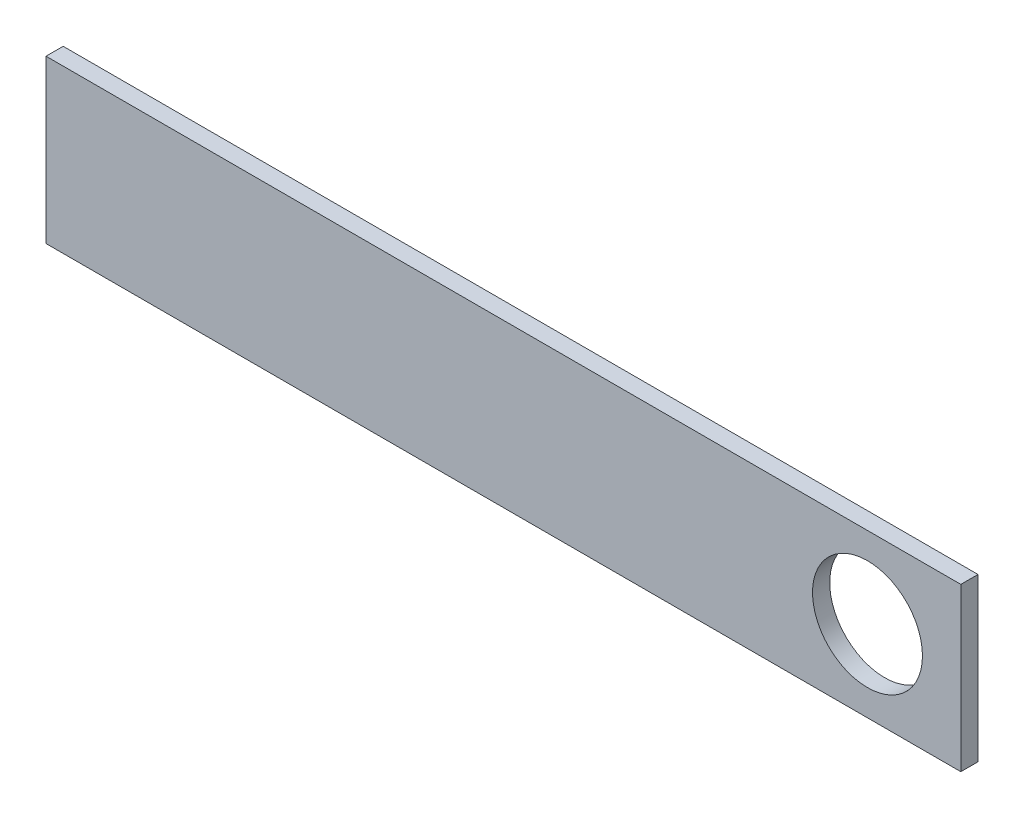
ISO-10303-21;
HEADER;
FILE_DESCRIPTION(('STEP AP214'),'2;1');
FILE_NAME('part.step','',(''),(''),'','','');
FILE_SCHEMA(('AUTOMOTIVE_DESIGN { 1 0 10303 214 1 1 1 1 }'));
ENDSEC;
DATA;
#1=APPLICATION_CONTEXT('core data for automotive mechanical design processes');
#2=APPLICATION_PROTOCOL_DEFINITION('international standard','automotive_design',2000,#1);
#3=PRODUCT_CONTEXT('',#1,'mechanical');
#4=PRODUCT('Part','Part','',(#3));
#5=PRODUCT_RELATED_PRODUCT_CATEGORY('part','',(#4));
#6=PRODUCT_DEFINITION_FORMATION('','',#4);
#7=PRODUCT_DEFINITION_CONTEXT('part definition',#1,'design');
#8=PRODUCT_DEFINITION('design','',#6,#7);
#9=PRODUCT_DEFINITION_SHAPE('','',#8);
#10=(LENGTH_UNIT() NAMED_UNIT(*) SI_UNIT(.MILLI.,.METRE.));
#11=(NAMED_UNIT(*) PLANE_ANGLE_UNIT() SI_UNIT($,.RADIAN.));
#12=(NAMED_UNIT(*) SI_UNIT($,.STERADIAN.) SOLID_ANGLE_UNIT());
#13=UNCERTAINTY_MEASURE_WITH_UNIT(LENGTH_MEASURE(1.E-05),#10,'distance_accuracy_value','');
#14=(GEOMETRIC_REPRESENTATION_CONTEXT(3) GLOBAL_UNCERTAINTY_ASSIGNED_CONTEXT((#13)) GLOBAL_UNIT_ASSIGNED_CONTEXT((#10,
#11,#12)) REPRESENTATION_CONTEXT('',''));
#15=CARTESIAN_POINT('',(0.,0.,0.));
#16=DIRECTION('',(0.,0.,1.));
#17=DIRECTION('',(1.,0.,0.));
#18=AXIS2_PLACEMENT_3D('',#15,#16,#17);
#19=CARTESIAN_POINT('',(-67.8561110498564,-48.7503047618274,-2.54));
#20=DIRECTION('',(-1.,0.,0.));
#21=DIRECTION('',(0.,0.,1.));
#22=AXIS2_PLACEMENT_3D('',#19,#20,#21);
#23=PLANE('',#22);
#24=DIRECTION('',(0.,-1.,0.));
#25=VECTOR('',#24,1.);
#26=CARTESIAN_POINT('',(-67.8561110498564,-48.7503047618274,0.));
#27=LINE('',#26,#25);
#28=CARTESIAN_POINT('',(-67.8561110498564,-48.7503047618274,0.));
#29=VERTEX_POINT('',#28);
#30=CARTESIAN_POINT('',(-67.8561110498564,-72.7506400697544,0.));
#31=VERTEX_POINT('',#30);
#32=EDGE_CURVE('E99',#29,#31,#27,.T.);
#33=ORIENTED_EDGE('',*,*,#32,.F.);
#34=DIRECTION('',(0.,0.,1.));
#35=VECTOR('',#34,1.);
#36=CARTESIAN_POINT('',(-67.8561110498564,-48.7503047618274,-2.54));
#37=LINE('',#36,#35);
#38=CARTESIAN_POINT('',(-67.8561110498564,-48.7503047618274,-2.54));
#39=VERTEX_POINT('',#38);
#40=EDGE_CURVE('E11',#39,#29,#37,.T.);
#41=ORIENTED_EDGE('',*,*,#40,.F.);
#42=DIRECTION('',(0.,-1.,0.));
#43=VECTOR('',#42,1.);
#44=CARTESIAN_POINT('',(-67.8561110498564,-48.7503047618274,-2.54));
#45=LINE('',#44,#43);
#46=CARTESIAN_POINT('',(-67.8561110498564,-72.7506400697544,-2.54));
#47=VERTEX_POINT('',#46);
#48=EDGE_CURVE('E92',#39,#47,#45,.T.);
#49=ORIENTED_EDGE('',*,*,#48,.T.);
#50=DIRECTION('',(0.,0.,1.));
#51=VECTOR('',#50,1.);
#52=CARTESIAN_POINT('',(-67.8561110498564,-72.7506400697544,-2.54));
#53=LINE('',#52,#51);
#54=EDGE_CURVE('E37',#47,#31,#53,.T.);
#55=ORIENTED_EDGE('',*,*,#54,.T.);
#56=EDGE_LOOP('',(#33,#41,#49,#55));
#57=FACE_BOUND('',#56,.T.);
#58=ADVANCED_FACE('F34',(#57),#23,.T.);
#59=CARTESIAN_POINT('',(-67.8561110498564,-48.7503047618274,-2.54));
#60=DIRECTION('',(0.,1.,0.));
#61=DIRECTION('',(0.,0.,1.));
#62=AXIS2_PLACEMENT_3D('',#59,#60,#61);
#63=PLANE('',#62);
#64=DIRECTION('',(-1.,0.,0.));
#65=VECTOR('',#64,1.);
#66=CARTESIAN_POINT('',(-67.8561110498564,-48.7503047618274,0.));
#67=LINE('',#66,#65);
#68=CARTESIAN_POINT('',(67.4652240809156,-48.7503047618274,0.));
#69=VERTEX_POINT('',#68);
#70=EDGE_CURVE('E94',#69,#29,#67,.T.);
#71=ORIENTED_EDGE('',*,*,#70,.F.);
#72=DIRECTION('',(0.,0.,1.));
#73=VECTOR('',#72,1.);
#74=CARTESIAN_POINT('',(67.4652240809156,-48.7503047618274,-2.54));
#75=LINE('',#74,#73);
#76=CARTESIAN_POINT('',(67.4652240809156,-48.7503047618274,-2.54));
#77=VERTEX_POINT('',#76);
#78=EDGE_CURVE('E43',#77,#69,#75,.T.);
#79=ORIENTED_EDGE('',*,*,#78,.F.);
#80=DIRECTION('',(-1.,0.,0.));
#81=VECTOR('',#80,1.);
#82=CARTESIAN_POINT('',(-67.8561110498564,-48.7503047618274,-2.54));
#83=LINE('',#82,#81);
#84=EDGE_CURVE('E89',#77,#39,#83,.T.);
#85=ORIENTED_EDGE('',*,*,#84,.T.);
#86=ORIENTED_EDGE('',*,*,#40,.T.);
#87=EDGE_LOOP('',(#71,#79,#85,#86));
#88=FACE_BOUND('',#87,.T.);
#89=ADVANCED_FACE('F110',(#88),#63,.T.);
#90=CARTESIAN_POINT('',(67.4652240809156,-48.7503047618274,-2.54));
#91=DIRECTION('',(1.,0.,0.));
#92=DIRECTION('',(0.,0.,-1.));
#93=AXIS2_PLACEMENT_3D('',#90,#91,#92);
#94=PLANE('',#93);
#95=DIRECTION('',(0.,1.,0.));
#96=VECTOR('',#95,1.);
#97=CARTESIAN_POINT('',(67.4652240809156,-48.7503047618274,0.));
#98=LINE('',#97,#96);
#99=CARTESIAN_POINT('',(67.4652240809156,-72.7506400697544,0.));
#100=VERTEX_POINT('',#99);
#101=EDGE_CURVE('E84',#100,#69,#98,.T.);
#102=ORIENTED_EDGE('',*,*,#101,.F.);
#103=DIRECTION('',(0.,0.,1.));
#104=VECTOR('',#103,1.);
#105=CARTESIAN_POINT('',(67.4652240809156,-72.7506400697544,-2.54));
#106=LINE('',#105,#104);
#107=CARTESIAN_POINT('',(67.4652240809156,-72.7506400697544,-2.54));
#108=VERTEX_POINT('',#107);
#109=EDGE_CURVE('E79',#108,#100,#106,.T.);
#110=ORIENTED_EDGE('',*,*,#109,.F.);
#111=DIRECTION('',(0.,1.,0.));
#112=VECTOR('',#111,1.);
#113=CARTESIAN_POINT('',(67.4652240809156,-48.7503047618274,-2.54));
#114=LINE('',#113,#112);
#115=EDGE_CURVE('E82',#108,#77,#114,.T.);
#116=ORIENTED_EDGE('',*,*,#115,.T.);
#117=ORIENTED_EDGE('',*,*,#78,.T.);
#118=EDGE_LOOP('',(#102,#110,#116,#117));
#119=FACE_BOUND('',#118,.T.);
#120=ADVANCED_FACE('F81',(#119),#94,.T.);
#121=CARTESIAN_POINT('',(-67.8561110498564,-72.7506400697544,-2.54));
#122=DIRECTION('',(0.,-1.,0.));
#123=DIRECTION('',(0.,0.,-1.));
#124=AXIS2_PLACEMENT_3D('',#121,#122,#123);
#125=PLANE('',#124);
#126=DIRECTION('',(1.,0.,0.));
#127=VECTOR('',#126,1.);
#128=CARTESIAN_POINT('',(-67.8561110498564,-72.7506400697544,0.));
#129=LINE('',#128,#127);
#130=EDGE_CURVE('E102',#31,#100,#129,.T.);
#131=ORIENTED_EDGE('',*,*,#130,.F.);
#132=ORIENTED_EDGE('',*,*,#54,.F.);
#133=DIRECTION('',(1.,0.,0.));
#134=VECTOR('',#133,1.);
#135=CARTESIAN_POINT('',(-67.8561110498564,-72.7506400697544,-2.54));
#136=LINE('',#135,#134);
#137=EDGE_CURVE('E88',#47,#108,#136,.T.);
#138=ORIENTED_EDGE('',*,*,#137,.T.);
#139=ORIENTED_EDGE('',*,*,#109,.T.);
#140=EDGE_LOOP('',(#131,#132,#138,#139));
#141=FACE_BOUND('',#140,.T.);
#142=ADVANCED_FACE('F91',(#141),#125,.T.);
#143=CARTESIAN_POINT('',(0.,0.,-2.54));
#144=DIRECTION('',(0.,0.,1.));
#145=DIRECTION('',(1.,0.,0.));
#146=AXIS2_PLACEMENT_3D('',#143,#144,#145);
#147=PLANE('',#146);
#148=CARTESIAN_POINT('',(53.65930267602,-60.7504724157909,-2.54));
#149=DIRECTION('',(0.,0.,1.));
#150=DIRECTION('',(1.,0.,0.));
#151=AXIS2_PLACEMENT_3D('',#148,#149,#150);
#152=CIRCLE('',#151,8.1301195861903);
#153=CARTESIAN_POINT('',(61.7894222622103,-60.7504724157909,-2.54));
#154=VERTEX_POINT('',#153);
#155=EDGE_CURVE('E103',#154,#154,#152,.T.);
#156=ORIENTED_EDGE('',*,*,#155,.T.);
#157=EDGE_LOOP('',(#156));
#158=FACE_BOUND('',#157,.T.);
#159=ORIENTED_EDGE('',*,*,#48,.F.);
#160=ORIENTED_EDGE('',*,*,#84,.F.);
#161=ORIENTED_EDGE('',*,*,#115,.F.);
#162=ORIENTED_EDGE('',*,*,#137,.F.);
#163=EDGE_LOOP('',(#159,#160,#161,#162));
#164=FACE_BOUND('',#163,.T.);
#165=ADVANCED_FACE('F87',(#158,#164),#147,.F.);
#166=CARTESIAN_POINT('',(0.,0.,0.));
#167=DIRECTION('',(0.,0.,1.));
#168=DIRECTION('',(1.,0.,0.));
#169=AXIS2_PLACEMENT_3D('',#166,#167,#168);
#170=PLANE('',#169);
#171=CARTESIAN_POINT('',(53.65930267602,-60.7504724157909,0.));
#172=DIRECTION('',(0.,0.,1.));
#173=DIRECTION('',(1.,0.,0.));
#174=AXIS2_PLACEMENT_3D('',#171,#172,#173);
#175=CIRCLE('',#174,8.1301195861903);
#176=CARTESIAN_POINT('',(61.7894222622103,-60.7504724157909,0.));
#177=VERTEX_POINT('',#176);
#178=EDGE_CURVE('E140',#177,#177,#175,.T.);
#179=ORIENTED_EDGE('',*,*,#178,.F.);
#180=EDGE_LOOP('',(#179));
#181=FACE_BOUND('',#180,.T.);
#182=ORIENTED_EDGE('',*,*,#32,.T.);
#183=ORIENTED_EDGE('',*,*,#130,.T.);
#184=ORIENTED_EDGE('',*,*,#101,.T.);
#185=ORIENTED_EDGE('',*,*,#70,.T.);
#186=EDGE_LOOP('',(#182,#183,#184,#185));
#187=FACE_BOUND('',#186,.T.);
#188=ADVANCED_FACE('F109',(#181,#187),#170,.T.);
#189=CARTESIAN_POINT('',(53.65930267602,-60.7504724157909,-2.54));
#190=DIRECTION('',(0.,0.,1.));
#191=DIRECTION('',(1.,0.,0.));
#192=AXIS2_PLACEMENT_3D('',#189,#190,#191);
#193=CYLINDRICAL_SURFACE('',#192,8.1301195861903);
#194=ORIENTED_EDGE('',*,*,#155,.F.);
#195=EDGE_LOOP('',(#194));
#196=FACE_BOUND('',#195,.T.);
#197=ORIENTED_EDGE('',*,*,#178,.T.);
#198=EDGE_LOOP('',(#197));
#199=FACE_BOUND('',#198,.T.);
#200=ADVANCED_FACE('F128',(#196,#199),#193,.F.);
#201=CLOSED_SHELL('',(#58,#89,#120,#142,#165,#188,#200));
#202=MANIFOLD_SOLID_BREP('B2',#201);
#203=ADVANCED_BREP_SHAPE_REPRESENTATION('',(#18,#202),#14);
#204=SHAPE_DEFINITION_REPRESENTATION(#9,#203);
ENDSEC;
END-ISO-10303-21;
